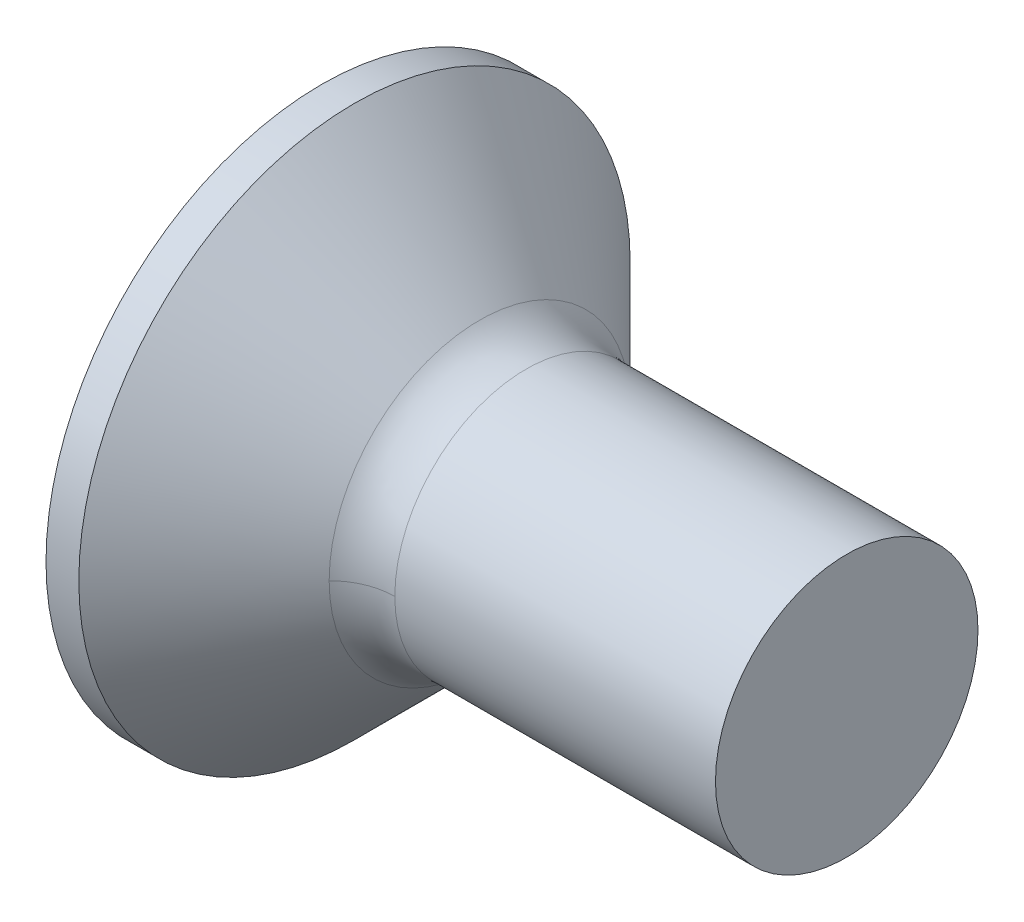
ISO-10303-21;
HEADER;
FILE_DESCRIPTION(('STEP AP214'),'2;1');
FILE_NAME('part.step','',(''),(''),'','','');
FILE_SCHEMA(('AUTOMOTIVE_DESIGN { 1 0 10303 214 1 1 1 1 }'));
ENDSEC;
DATA;
#1=APPLICATION_CONTEXT('core data for automotive mechanical design processes');
#2=APPLICATION_PROTOCOL_DEFINITION('international standard','automotive_design',2000,#1);
#3=PRODUCT_CONTEXT('',#1,'mechanical');
#4=PRODUCT('Part','Part','',(#3));
#5=PRODUCT_RELATED_PRODUCT_CATEGORY('part','',(#4));
#6=PRODUCT_DEFINITION_FORMATION('','',#4);
#7=PRODUCT_DEFINITION_CONTEXT('part definition',#1,'design');
#8=PRODUCT_DEFINITION('design','',#6,#7);
#9=PRODUCT_DEFINITION_SHAPE('','',#8);
#10=(LENGTH_UNIT() NAMED_UNIT(*) SI_UNIT(.MILLI.,.METRE.));
#11=(NAMED_UNIT(*) PLANE_ANGLE_UNIT() SI_UNIT($,.RADIAN.));
#12=(NAMED_UNIT(*) SI_UNIT($,.STERADIAN.) SOLID_ANGLE_UNIT());
#13=UNCERTAINTY_MEASURE_WITH_UNIT(LENGTH_MEASURE(1.E-05),#10,'distance_accuracy_value','');
#14=(GEOMETRIC_REPRESENTATION_CONTEXT(3) GLOBAL_UNCERTAINTY_ASSIGNED_CONTEXT((#13)) GLOBAL_UNIT_ASSIGNED_CONTEXT((#10,
#11,#12)) REPRESENTATION_CONTEXT('',''));
#15=CARTESIAN_POINT('',(0.,0.,0.));
#16=DIRECTION('',(0.,0.,1.));
#17=DIRECTION('',(1.,0.,0.));
#18=AXIS2_PLACEMENT_3D('',#15,#16,#17);
#19=CARTESIAN_POINT('',(2.51,0.,0.));
#20=DIRECTION('',(-1.,0.,0.));
#21=DIRECTION('',(0.,0.,1.));
#22=AXIS2_PLACEMENT_3D('',#19,#20,#21);
#23=CONICAL_SURFACE('',#22,0.851,0.0698131700884116);
#24=CARTESIAN_POINT('',(2.51000000000001,0.,0.));
#25=DIRECTION('',(-1.,0.,0.));
#26=DIRECTION('',(0.,0.,1.));
#27=AXIS2_PLACEMENT_3D('',#24,#25,#26);
#28=CIRCLE('',#27,0.851);
#29=CARTESIAN_POINT('',(2.51000000000001,0.515000000128447,-0.677477674811281));
#30=VERTEX_POINT('',#29);
#31=CARTESIAN_POINT('',(2.50999999998821,0.677477674911375,-0.514999999998138));
#32=VERTEX_POINT('',#31);
#33=EDGE_CURVE('E125',#30,#32,#28,.F.);
#34=ORIENTED_EDGE('',*,*,#33,.T.);
#35=CARTESIAN_POINT('',(-7.25470712172385E-11,0.887981255320598,-0.514999999738052));
#36=CARTESIAN_POINT('',(0.318819879636719,0.862192153268574,-0.51499999990922));
#37=CARTESIAN_POINT('',(0.637620357667007,0.836153848252877,-0.514999999976439));
#38=CARTESIAN_POINT('',(1.27515765628023,0.783330183982056,-0.515000000023561));
#39=CARTESIAN_POINT('',(1.59389447718419,0.756544828595421,-0.515000000003464));
#40=CARTESIAN_POINT('',(2.01216629989946,0.720736675273492,-0.514999999998918));
#41=CARTESIAN_POINT('',(2.11173974714975,0.712163242481372,-0.514999999999459));
#42=CARTESIAN_POINT('',(2.31087725771429,0.694906260205415,-0.515000000000541));
#43=CARTESIAN_POINT('',(2.41044132101322,0.686222710544853,-0.515000000001082));
#44=CARTESIAN_POINT('',(2.50999999997648,0.677477674910992,-0.515));
#45=B_SPLINE_CURVE_WITH_KNOTS('',3,(#35,#36,#37,#38,#39,#40,#41,#42,#43,#44),.UNSPECIFIED.,.F.,
.F.,(4,2,2,2,4),(0.,0.959584754186786,1.91916454022962,2.21899005858181,2.51881605817835),.UNSPECIFIED.);
#46=CARTESIAN_POINT('',(0.,0.887981255466366,-0.515));
#47=VERTEX_POINT('',#46);
#48=EDGE_CURVE('E118',#47,#32,#45,.T.);
#49=ORIENTED_EDGE('',*,*,#48,.F.);
#50=CARTESIAN_POINT('',(0.,0.,0.));
#51=DIRECTION('',(-1.,0.,0.));
#52=DIRECTION('',(0.,0.,1.));
#53=AXIS2_PLACEMENT_3D('',#50,#51,#52);
#54=CIRCLE('',#53,1.026516298);
#55=CARTESIAN_POINT('',(-2.85935113966268E-11,0.515,-0.887981255468678));
#56=VERTEX_POINT('',#55);
#57=EDGE_CURVE('E19',#47,#56,#54,.T.);
#58=ORIENTED_EDGE('',*,*,#57,.T.);
#59=CARTESIAN_POINT('',(2.50999999998217,0.515,-0.677477674910489));
#60=CARTESIAN_POINT('',(2.24584461878122,0.515,-0.700667679814435));
#61=CARTESIAN_POINT('',(1.98165392257068,0.515,-0.723450461944113));
#62=CARTESIAN_POINT('',(1.45321766745748,0.515,-0.768360402906354));
#63=CARTESIAN_POINT('',(1.18897210874822,0.515,-0.79048756401168));
#64=CARTESIAN_POINT('',(0.770601353287124,0.515,-0.825124883970429));
#65=CARTESIAN_POINT('',(0.616489661388993,0.515,-0.837798921148617));
#66=CARTESIAN_POINT('',(0.308253737302725,0.515,-0.862997437699919));
#67=CARTESIAN_POINT('',(0.154129505090094,0.515,-0.875521916773493));
#68=CARTESIAN_POINT('',(-5.6932000135886E-11,0.515,-0.887981255470971));
#69=B_SPLINE_CURVE_WITH_KNOTS('',3,(#59,#60,#61,#62,#63,#64,#65,#66,#67,#68),.UNSPECIFIED.,.F.,
.F.,(4,2,2,2,4),(0.,0.795513110102209,1.59102346217274,2.05491931016661,2.51881608711106),.UNSPECIFIED.);
#70=EDGE_CURVE('E148',#30,#56,#69,.T.);
#71=ORIENTED_EDGE('',*,*,#70,.F.);
#72=EDGE_LOOP('',(#34,#49,#58,#71));
#73=FACE_BOUND('',#72,.T.);
#74=ADVANCED_FACE('F15',(#73),#23,.F.);
#75=CARTESIAN_POINT('',(0.,0.668342541,-0.515));
#76=DIRECTION('',(0.,0.,1.));
#77=DIRECTION('',(1.,0.,0.));
#78=AXIS2_PLACEMENT_3D('',#75,#76,#77);
#79=PLANE('',#78);
#80=DIRECTION('',(0.,1.,0.));
#81=VECTOR('',#80,1.);
#82=CARTESIAN_POINT('',(2.51,1.4387388375,-0.515));
#83=LINE('',#82,#81);
#84=CARTESIAN_POINT('',(2.51,0.948560206845572,-0.515));
#85=VERTEX_POINT('',#84);
#86=EDGE_CURVE('E139',#32,#85,#83,.T.);
#87=ORIENTED_EDGE('',*,*,#86,.T.);
#88=DIRECTION('',(0.894934367754668,-0.446197800769517,0.));
#89=VECTOR('',#88,1.);
#90=CARTESIAN_POINT('',(1.255,1.5742801035,-0.515));
#91=LINE('',#90,#89);
#92=CARTESIAN_POINT('',(0.,2.19999999989061,-0.515));
#93=VERTEX_POINT('',#92);
#94=EDGE_CURVE('E122',#93,#85,#91,.T.);
#95=ORIENTED_EDGE('',*,*,#94,.F.);
#96=DIRECTION('',(0.,-1.,0.));
#97=VECTOR('',#96,1.);
#98=CARTESIAN_POINT('',(0.,1.4387388375,-0.515));
#99=LINE('',#98,#97);
#100=EDGE_CURVE('E113',#93,#47,#99,.T.);
#101=ORIENTED_EDGE('',*,*,#100,.T.);
#102=ORIENTED_EDGE('',*,*,#48,.T.);
#103=EDGE_LOOP('',(#87,#95,#101,#102));
#104=FACE_BOUND('',#103,.T.);
#105=ADVANCED_FACE('F116',(#104),#79,.T.);
#106=CARTESIAN_POINT('',(8.,-2.024,2.024));
#107=DIRECTION('',(1.,0.,0.));
#108=DIRECTION('',(0.,0.,-1.));
#109=AXIS2_PLACEMENT_3D('',#106,#107,#108);
#110=PLANE('',#109);
#111=CARTESIAN_POINT('',(8.,0.,0.));
#112=DIRECTION('',(-1.,0.,0.));
#113=DIRECTION('',(0.,0.,1.));
#114=AXIS2_PLACEMENT_3D('',#111,#112,#113);
#115=CIRCLE('',#114,2.);
#116=CARTESIAN_POINT('',(8.,0.,2.));
#117=VERTEX_POINT('',#116);
#118=EDGE_CURVE('E380',#117,#117,#115,.F.);
#119=ORIENTED_EDGE('',*,*,#118,.T.);
#120=EDGE_LOOP('',(#119));
#121=FACE_BOUND('',#120,.T.);
#122=ADVANCED_FACE('F519',(#121),#110,.T.);
#123=CARTESIAN_POINT('',(0.,0.515,-2.209135134));
#124=DIRECTION('',(0.,-1.,0.));
#125=DIRECTION('',(1.,0.,0.));
#126=AXIS2_PLACEMENT_3D('',#123,#124,#125);
#127=PLANE('',#126);
#128=DIRECTION('',(0.,0.,-1.));
#129=VECTOR('',#128,1.);
#130=CARTESIAN_POINT('',(0.,0.515,-1.4387388375));
#131=LINE('',#130,#129);
#132=CARTESIAN_POINT('',(0.,0.515,-2.19999999989061));
#133=VERTEX_POINT('',#132);
#134=EDGE_CURVE('E134',#56,#133,#131,.T.);
#135=ORIENTED_EDGE('',*,*,#134,.T.);
#136=DIRECTION('',(-0.894934367754668,0.,-0.446197800769517));
#137=VECTOR('',#136,1.);
#138=CARTESIAN_POINT('',(1.255,0.515,-1.5742801035));
#139=LINE('',#138,#137);
#140=CARTESIAN_POINT('',(2.51,0.515,-0.948560206845572));
#141=VERTEX_POINT('',#140);
#142=EDGE_CURVE('E362',#141,#133,#139,.T.);
#143=ORIENTED_EDGE('',*,*,#142,.F.);
#144=DIRECTION('',(0.,0.,1.));
#145=VECTOR('',#144,1.);
#146=CARTESIAN_POINT('',(2.51,0.515,-1.4387388375));
#147=LINE('',#146,#145);
#148=EDGE_CURVE('E140',#141,#30,#147,.T.);
#149=ORIENTED_EDGE('',*,*,#148,.T.);
#150=ORIENTED_EDGE('',*,*,#70,.T.);
#151=EDGE_LOOP('',(#135,#143,#149,#150));
#152=FACE_BOUND('',#151,.T.);
#153=ADVANCED_FACE('F550',(#152),#127,.T.);
#154=CARTESIAN_POINT('',(0.,2.2,-0.515));
#155=DIRECTION('',(-0.446197800769517,-0.894934367754668,0.));
#156=DIRECTION('',(0.894934367754668,-0.446197800769517,0.));
#157=AXIS2_PLACEMENT_3D('',#154,#155,#156);
#158=PLANE('',#157);
#159=ORIENTED_EDGE('',*,*,#94,.T.);
#160=DIRECTION('',(0.,0.,1.));
#161=VECTOR('',#160,1.);
#162=CARTESIAN_POINT('',(2.51,0.948560207,0.));
#163=LINE('',#162,#161);
#164=CARTESIAN_POINT('',(2.51,0.948560206768358,0.515));
#165=VERTEX_POINT('',#164);
#166=EDGE_CURVE('E378',#85,#165,#163,.T.);
#167=ORIENTED_EDGE('',*,*,#166,.T.);
#168=DIRECTION('',(0.894934367735432,-0.446197800808098,0.));
#169=VECTOR('',#168,1.);
#170=CARTESIAN_POINT('',(0.,2.19999999967182,0.515));
#171=LINE('',#170,#169);
#172=CARTESIAN_POINT('',(0.,2.19999999983591,0.515));
#173=VERTEX_POINT('',#172);
#174=EDGE_CURVE('E352',#173,#165,#171,.T.);
#175=ORIENTED_EDGE('',*,*,#174,.F.);
#176=DIRECTION('',(0.,0.,-1.));
#177=VECTOR('',#176,1.);
#178=CARTESIAN_POINT('',(0.,2.2,0.));
#179=LINE('',#178,#177);
#180=EDGE_CURVE('E373',#173,#93,#179,.T.);
#181=ORIENTED_EDGE('',*,*,#180,.T.);
#182=EDGE_LOOP('',(#159,#167,#175,#181));
#183=FACE_BOUND('',#182,.T.);
#184=ADVANCED_FACE('F164',(#183),#158,.T.);
#185=CARTESIAN_POINT('',(8.,0.,0.));
#186=DIRECTION('',(-1.,0.,0.));
#187=DIRECTION('',(0.,0.,1.));
#188=AXIS2_PLACEMENT_3D('',#185,#186,#187);
#189=CYLINDRICAL_SURFACE('',#188,2.);
#190=ORIENTED_EDGE('',*,*,#118,.F.);
#191=EDGE_LOOP('',(#190));
#192=FACE_BOUND('',#191,.T.);
#193=CARTESIAN_POINT('',(3.11421356207373,0.,0.));
#194=DIRECTION('',(1.,0.,0.));
#195=DIRECTION('',(0.,1.,0.));
#196=AXIS2_PLACEMENT_3D('',#193,#194,#195);
#197=CIRCLE('',#196,2.00000000028272);
#198=CARTESIAN_POINT('',(3.11421356205332,-2.05103428515331E-10,-2.00000000021204));
#199=VERTEX_POINT('',#198);
#200=CARTESIAN_POINT('',(3.11421356207076,-8.9793628428733E-11,2.00000000021204));
#201=VERTEX_POINT('',#200);
#202=EDGE_CURVE('E342',#199,#201,#197,.T.);
#203=ORIENTED_EDGE('',*,*,#202,.T.);
#204=CARTESIAN_POINT('',(3.11421356207373,0.,0.));
#205=DIRECTION('',(1.,0.,0.));
#206=DIRECTION('',(0.,1.,0.));
#207=AXIS2_PLACEMENT_3D('',#204,#205,#206);
#208=CIRCLE('',#207,2.00000000028272);
#209=EDGE_CURVE('E331',#201,#199,#208,.T.);
#210=ORIENTED_EDGE('',*,*,#209,.T.);
#211=EDGE_LOOP('',(#203,#210));
#212=FACE_BOUND('',#211,.T.);
#213=ADVANCED_FACE('F159',(#192,#212),#189,.T.);
#214=CARTESIAN_POINT('',(2.51,0.515,-0.948560207));
#215=DIRECTION('',(-0.446197800769517,0.,0.894934367754668));
#216=DIRECTION('',(-0.894934367754668,0.,-0.446197800769517));
#217=AXIS2_PLACEMENT_3D('',#214,#215,#216);
#218=PLANE('',#217);
#219=DIRECTION('',(-0.894934367735432,0.,-0.446197800808098));
#220=VECTOR('',#219,1.);
#221=CARTESIAN_POINT('',(2.51,-0.515,-0.948560206536716));
#222=LINE('',#221,#220);
#223=CARTESIAN_POINT('',(2.51,-0.515,-0.948560206768358));
#224=VERTEX_POINT('',#223);
#225=CARTESIAN_POINT('',(0.,-0.515,-2.19999999983591));
#226=VERTEX_POINT('',#225);
#227=EDGE_CURVE('E317',#224,#226,#222,.T.);
#228=ORIENTED_EDGE('',*,*,#227,.F.);
#229=DIRECTION('',(0.,1.,0.));
#230=VECTOR('',#229,1.);
#231=CARTESIAN_POINT('',(2.51,0.,-0.948560207));
#232=LINE('',#231,#230);
#233=EDGE_CURVE('E355',#224,#141,#232,.T.);
#234=ORIENTED_EDGE('',*,*,#233,.T.);
#235=ORIENTED_EDGE('',*,*,#142,.T.);
#236=DIRECTION('',(0.,-1.,0.));
#237=VECTOR('',#236,1.);
#238=CARTESIAN_POINT('',(0.,0.,-2.2));
#239=LINE('',#238,#237);
#240=EDGE_CURVE('E358',#133,#226,#239,.T.);
#241=ORIENTED_EDGE('',*,*,#240,.T.);
#242=EDGE_LOOP('',(#228,#234,#235,#241));
#243=FACE_BOUND('',#242,.T.);
#244=ADVANCED_FACE('F163',(#243),#218,.T.);
#245=CARTESIAN_POINT('',(0.,0.668342541,0.515));
#246=DIRECTION('',(0.,0.,-1.));
#247=DIRECTION('',(0.,1.,0.));
#248=AXIS2_PLACEMENT_3D('',#245,#246,#247);
#249=PLANE('',#248);
#250=DIRECTION('',(0.,1.,0.));
#251=VECTOR('',#250,1.);
#252=CARTESIAN_POINT('',(0.,1.4387388375,0.515));
#253=LINE('',#252,#251);
#254=CARTESIAN_POINT('',(0.,0.887981255466366,0.515));
#255=VERTEX_POINT('',#254);
#256=EDGE_CURVE('E347',#255,#173,#253,.T.);
#257=ORIENTED_EDGE('',*,*,#256,.T.);
#258=ORIENTED_EDGE('',*,*,#174,.T.);
#259=DIRECTION('',(0.,-1.,0.));
#260=VECTOR('',#259,1.);
#261=CARTESIAN_POINT('',(2.51,1.4387388375,0.515));
#262=LINE('',#261,#260);
#263=CARTESIAN_POINT('',(2.51000000000001,0.677477675015967,0.514999999859184));
#264=VERTEX_POINT('',#263);
#265=EDGE_CURVE('E353',#165,#264,#262,.T.);
#266=ORIENTED_EDGE('',*,*,#265,.T.);
#267=CARTESIAN_POINT('',(-6.23890795979364E-11,0.887981255359255,0.514999999806251));
#268=CARTESIAN_POINT('',(0.318819879644557,0.862192153281618,0.514999999932855));
#269=CARTESIAN_POINT('',(0.637620357673799,0.83615384825587,0.514999999982573));
#270=CARTESIAN_POINT('',(1.27515765628601,0.78333018397802,0.515000000017427));
#271=CARTESIAN_POINT('',(1.59389447719001,0.756544828594407,0.515000000002563));
#272=CARTESIAN_POINT('',(2.01216629990365,0.720736675273295,0.514999999999199));
#273=CARTESIAN_POINT('',(2.11173974715245,0.71216324248122,0.5149999999996));
#274=CARTESIAN_POINT('',(2.31087725771403,0.694906260205355,0.5150000000004));
#275=CARTESIAN_POINT('',(2.41044132101147,0.686222710544842,0.515000000000801));
#276=CARTESIAN_POINT('',(2.50999999997326,0.677477674911275,0.515));
#277=B_SPLINE_CURVE_WITH_KNOTS('',3,(#267,#268,#269,#270,#271,#272,#273,#274,#275,#276),
.UNSPECIFIED.,.F.,.F.,(4,2,2,2,4),(0.,0.959584754186115,1.91916454022833,2.21899005857607,
2.51881605816815),.UNSPECIFIED.);
#278=EDGE_CURVE('E199',#255,#264,#277,.T.);
#279=ORIENTED_EDGE('',*,*,#278,.F.);
#280=EDGE_LOOP('',(#257,#258,#266,#279));
#281=FACE_BOUND('',#280,.T.);
#282=ADVANCED_FACE('F172',(#281),#249,.T.);
#283=CARTESIAN_POINT('',(3.214046979,0.,2.004995835));
#284=CARTESIAN_POINT('',(3.214046979,4.009991669,2.004995835));
#285=CARTESIAN_POINT('',(3.214046979,4.009991669,-2.004995835));
#286=CARTESIAN_POINT('',(3.214046979,0.,-2.004995835));
#287=CARTESIAN_POINT('',(2.873263226,0.,1.970803409));
#288=CARTESIAN_POINT('',(2.873263226,3.941606817,1.970803409));
#289=CARTESIAN_POINT('',(2.873263226,3.941606817,-1.970803409));
#290=CARTESIAN_POINT('',(2.873263226,0.,-1.970803409));
#291=CARTESIAN_POINT('',(2.55683929,0.,2.101870494));
#292=CARTESIAN_POINT('',(2.55683929,4.203740989,2.101870494));
#293=CARTESIAN_POINT('',(2.55683929,4.203740989,-2.101870494));
#294=CARTESIAN_POINT('',(2.55683929,0.,-2.101870494));
#295=CARTESIAN_POINT('',(2.340046484,0.,2.367018693));
#296=CARTESIAN_POINT('',(2.340046484,4.734037387,2.367018693));
#297=CARTESIAN_POINT('',(2.340046484,4.734037387,-2.367018693));
#298=CARTESIAN_POINT('',(2.340046484,0.,-2.367018693));
#299=(BOUNDED_SURFACE() B_SPLINE_SURFACE(3,3,((#283,#284,#285,#286),(#287,#288,#289,#290),(#291,
#292,#293,#294),(#295,#296,#297,#298)),.UNSPECIFIED.,.F.,.F.,
.F.) B_SPLINE_SURFACE_WITH_KNOTS((4,4),(4,4),(0.,1.),(0.,1.),
.UNSPECIFIED.) GEOMETRIC_REPRESENTATION_ITEM() RATIONAL_B_SPLINE_SURFACE(((1.,0.333333333333333,
0.333333333333333,1.),(0.920706259011135,0.306902086337045,0.306902086337045,0.920706259011135),
(0.920706259011135,0.306902086337045,0.306902086337045,0.920706259011135),(1.,0.333333333333333,
0.333333333333333,1.))) REPRESENTATION_ITEM('') SURFACE());
#300=CARTESIAN_POINT('',(2.40710678099998,0.,0.));
#301=DIRECTION('',(-1.,0.,0.));
#302=DIRECTION('',(0.,0.,1.));
#303=AXIS2_PLACEMENT_3D('',#300,#301,#302);
#304=CIRCLE('',#303,2.292893219);
#305=CARTESIAN_POINT('',(2.40710678110323,-7.05420390654683E-10,-2.29289321882874));
#306=VERTEX_POINT('',#305);
#307=CARTESIAN_POINT('',(2.40710678096737,-2.05887201733649E-10,2.2928932189646));
#308=VERTEX_POINT('',#307);
#309=EDGE_CURVE('E303',#306,#308,#304,.F.);
#310=CARTESIAN_POINT('',(3.214046979,0.,2.004995835));
#311=CARTESIAN_POINT('',(2.873263226,0.,1.970803409));
#312=CARTESIAN_POINT('',(2.55683929,0.,2.101870494));
#313=CARTESIAN_POINT('',(2.340046484,0.,2.367018693));
#314=(BOUNDED_CURVE() B_SPLINE_CURVE(3,(#310,#311,#312,#313),.UNSPECIFIED.,.F.,
.F.) B_SPLINE_CURVE_WITH_KNOTS((4,4),(0.,1.),
.UNSPECIFIED.) CURVE() GEOMETRIC_REPRESENTATION_ITEM() RATIONAL_B_SPLINE_CURVE((1.,
0.920706259011135,0.920706259011135,1.)) REPRESENTATION_ITEM(''));
#315=EDGE_CURVE('E336',#308,#201,#314,.F.);
#316=CARTESIAN_POINT('',(3.214046979,0.,-2.004995835));
#317=CARTESIAN_POINT('',(2.873263226,0.,-1.970803409));
#318=CARTESIAN_POINT('',(2.55683929,0.,-2.101870494));
#319=CARTESIAN_POINT('',(2.340046484,0.,-2.367018693));
#320=(BOUNDED_CURVE() B_SPLINE_CURVE(3,(#316,#317,#318,#319),.UNSPECIFIED.,.F.,
.F.) B_SPLINE_CURVE_WITH_KNOTS((4,4),(0.,1.),
.UNSPECIFIED.) CURVE() GEOMETRIC_REPRESENTATION_ITEM() RATIONAL_B_SPLINE_CURVE((1.,
0.920706259011135,0.920706259011135,1.)) REPRESENTATION_ITEM(''));
#321=EDGE_CURVE('E322',#199,#306,#320,.T.);
#322=ORIENTED_EDGE('',*,*,#309,.T.);
#323=ORIENTED_EDGE('',*,*,#315,.T.);
#324=ORIENTED_EDGE('',*,*,#202,.F.);
#325=ORIENTED_EDGE('',*,*,#321,.T.);
#326=EDGE_LOOP('',(#322,#323,#324,#325));
#327=FACE_BOUND('',#326,.T.);
#328=ADVANCED_FACE('F166',(#327),#299,.F.);
#329=CARTESIAN_POINT('',(3.214046979,0.,-2.004995835));
#330=CARTESIAN_POINT('',(3.214046979,-4.009991669,-2.004995835));
#331=CARTESIAN_POINT('',(3.214046979,-4.009991669,2.004995835));
#332=CARTESIAN_POINT('',(3.214046979,0.,2.004995835));
#333=CARTESIAN_POINT('',(2.873263226,0.,-1.970803409));
#334=CARTESIAN_POINT('',(2.873263226,-3.941606817,-1.970803409));
#335=CARTESIAN_POINT('',(2.873263226,-3.941606817,1.970803409));
#336=CARTESIAN_POINT('',(2.873263226,0.,1.970803409));
#337=CARTESIAN_POINT('',(2.55683929,0.,-2.101870494));
#338=CARTESIAN_POINT('',(2.55683929,-4.203740989,-2.101870494));
#339=CARTESIAN_POINT('',(2.55683929,-4.203740989,2.101870494));
#340=CARTESIAN_POINT('',(2.55683929,0.,2.101870494));
#341=CARTESIAN_POINT('',(2.340046484,0.,-2.367018693));
#342=CARTESIAN_POINT('',(2.340046484,-4.734037387,-2.367018693));
#343=CARTESIAN_POINT('',(2.340046484,-4.734037387,2.367018693));
#344=CARTESIAN_POINT('',(2.340046484,0.,2.367018693));
#345=(BOUNDED_SURFACE() B_SPLINE_SURFACE(3,3,((#329,#330,#331,#332),(#333,#334,#335,#336),(#337,
#338,#339,#340),(#341,#342,#343,#344)),.UNSPECIFIED.,.F.,.F.,
.F.) B_SPLINE_SURFACE_WITH_KNOTS((4,4),(4,4),(0.,1.),(0.,1.),
.UNSPECIFIED.) GEOMETRIC_REPRESENTATION_ITEM() RATIONAL_B_SPLINE_SURFACE(((1.,0.333333333333333,
0.333333333333333,1.),(0.920706259011135,0.306902086337045,0.306902086337045,0.920706259011135),
(0.920706259011135,0.306902086337045,0.306902086337045,0.920706259011135),(1.,0.333333333333333,
0.333333333333333,1.))) REPRESENTATION_ITEM('') SURFACE());
#346=CARTESIAN_POINT('',(2.40710678099998,0.,0.));
#347=DIRECTION('',(-1.,0.,0.));
#348=DIRECTION('',(0.,0.,1.));
#349=AXIS2_PLACEMENT_3D('',#346,#347,#348);
#350=CIRCLE('',#349,2.292893219);
#351=EDGE_CURVE('E297',#308,#306,#350,.F.);
#352=ORIENTED_EDGE('',*,*,#321,.F.);
#353=ORIENTED_EDGE('',*,*,#209,.F.);
#354=ORIENTED_EDGE('',*,*,#315,.F.);
#355=ORIENTED_EDGE('',*,*,#351,.T.);
#356=EDGE_LOOP('',(#352,#353,#354,#355));
#357=FACE_BOUND('',#356,.T.);
#358=ADVANCED_FACE('F171',(#357),#345,.F.);
#359=CARTESIAN_POINT('',(0.,-0.515,-2.209135134));
#360=DIRECTION('',(0.,1.,0.));
#361=DIRECTION('',(0.,0.,1.));
#362=AXIS2_PLACEMENT_3D('',#359,#360,#361);
#363=PLANE('',#362);
#364=DIRECTION('',(0.,0.,-1.));
#365=VECTOR('',#364,1.);
#366=CARTESIAN_POINT('',(2.51,-0.515,-1.4387388375));
#367=LINE('',#366,#365);
#368=CARTESIAN_POINT('',(2.51000000000001,-0.515000000067614,-0.677477674857525));
#369=VERTEX_POINT('',#368);
#370=EDGE_CURVE('E318',#369,#224,#367,.T.);
#371=ORIENTED_EDGE('',*,*,#370,.T.);
#372=ORIENTED_EDGE('',*,*,#227,.T.);
#373=DIRECTION('',(0.,0.,1.));
#374=VECTOR('',#373,1.);
#375=CARTESIAN_POINT('',(0.,-0.515,-1.4387388375));
#376=LINE('',#375,#374);
#377=CARTESIAN_POINT('',(-2.98730558439721E-11,-0.515,-0.887981255468781));
#378=VERTEX_POINT('',#377);
#379=EDGE_CURVE('E320',#226,#378,#376,.T.);
#380=ORIENTED_EDGE('',*,*,#379,.T.);
#381=CARTESIAN_POINT('',(2.50999999998707,-0.515,-0.677477674910059));
#382=CARTESIAN_POINT('',(2.24584461878623,-0.515,-0.700667679814001));
#383=CARTESIAN_POINT('',(1.98165392257579,-0.515,-0.723450461943674));
#384=CARTESIAN_POINT('',(1.45321766746281,-0.515,-0.768360402905906));
#385=CARTESIAN_POINT('',(1.18897210875365,-0.515,-0.790487564011227));
#386=CARTESIAN_POINT('',(0.77060135329132,-0.515,-0.825124883970084));
#387=CARTESIAN_POINT('',(0.616489661391847,-0.515,-0.837798921148383));
#388=CARTESIAN_POINT('',(0.308253737302892,-0.515,-0.862997437699906));
#389=CARTESIAN_POINT('',(0.154129505088917,-0.515,-0.875521916773589));
#390=CARTESIAN_POINT('',(-5.94528920877672E-11,-0.515,-0.887981255471175));
#391=B_SPLINE_CURVE_WITH_KNOTS('',3,(#381,#382,#383,#384,#385,#386,#387,#388,#389,#390),
.UNSPECIFIED.,.F.,.F.,(4,2,2,2,4),(0.,0.795513110101889,1.5910234621721,2.05491931017002,
2.5188160871185),.UNSPECIFIED.);
#392=EDGE_CURVE('E289',#369,#378,#391,.T.);
#393=ORIENTED_EDGE('',*,*,#392,.F.);
#394=EDGE_LOOP('',(#371,#372,#380,#393));
#395=FACE_BOUND('',#394,.T.);
#396=ADVANCED_FACE('F183',(#395),#363,.T.);
#397=CARTESIAN_POINT('',(2.51,0.,0.));
#398=DIRECTION('',(-1.,0.,0.));
#399=DIRECTION('',(0.,0.,1.));
#400=AXIS2_PLACEMENT_3D('',#397,#398,#399);
#401=CONICAL_SURFACE('',#400,0.851,0.0698131700884116);
#402=CARTESIAN_POINT('',(0.,0.,0.));
#403=DIRECTION('',(-1.,0.,0.));
#404=DIRECTION('',(0.,0.,1.));
#405=AXIS2_PLACEMENT_3D('',#402,#403,#404);
#406=CIRCLE('',#405,1.026516298);
#407=CARTESIAN_POINT('',(0.,0.515,0.887981255466366));
#408=VERTEX_POINT('',#407);
#409=EDGE_CURVE('E316',#408,#255,#406,.T.);
#410=ORIENTED_EDGE('',*,*,#409,.T.);
#411=ORIENTED_EDGE('',*,*,#278,.T.);
#412=CARTESIAN_POINT('',(2.51000000000001,0.,0.));
#413=DIRECTION('',(-1.,0.,0.));
#414=DIRECTION('',(0.,0.,1.));
#415=AXIS2_PLACEMENT_3D('',#412,#413,#414);
#416=CIRCLE('',#415,0.851);
#417=CARTESIAN_POINT('',(2.50999999998668,0.514999999928661,0.677477674964324));
#418=VERTEX_POINT('',#417);
#419=EDGE_CURVE('E313',#264,#418,#416,.F.);
#420=ORIENTED_EDGE('',*,*,#419,.T.);
#421=CARTESIAN_POINT('',(-6.26901258969882E-11,0.514999999808638,0.887981255360661));
#422=CARTESIAN_POINT('',(0.31881987964419,0.514999999933682,0.862192153282127));
#423=CARTESIAN_POINT('',(0.637620357673408,0.514999999982788,0.836153848256026));
#424=CARTESIAN_POINT('',(1.27515765628561,0.515000000017212,0.783330183977929));
#425=CARTESIAN_POINT('',(1.59389447718963,0.515000000002531,0.756544828594421));
#426=CARTESIAN_POINT('',(2.01216629990336,0.514999999999209,0.720736675273325));
#427=CARTESIAN_POINT('',(2.11173974715225,0.514999999999605,0.712163242481241));
#428=CARTESIAN_POINT('',(2.31087725771398,0.515000000000395,0.694906260205356));
#429=CARTESIAN_POINT('',(2.41044132101151,0.515000000000791,0.686222710544833));
#430=CARTESIAN_POINT('',(2.50999999997338,0.515,0.677477674911264));
#431=B_SPLINE_CURVE_WITH_KNOTS('',3,(#421,#422,#423,#424,#425,#426,#427,#428,#429,#430),
.UNSPECIFIED.,.F.,.F.,(4,2,2,2,4),(0.,0.959584754186134,1.91916454022837,2.21899005857636,
2.51881605816869),.UNSPECIFIED.);
#432=EDGE_CURVE('E207',#408,#418,#431,.T.);
#433=ORIENTED_EDGE('',*,*,#432,.F.);
#434=EDGE_LOOP('',(#410,#411,#420,#433));
#435=FACE_BOUND('',#434,.T.);
#436=ADVANCED_FACE('F185',(#435),#401,.F.);
#437=CARTESIAN_POINT('',(2.407106781,0.,0.));
#438=DIRECTION('',(-1.,0.,0.));
#439=DIRECTION('',(0.,0.,1.));
#440=AXIS2_PLACEMENT_3D('',#437,#438,#439);
#441=CONICAL_SURFACE('',#440,2.292893219,0.785398163397448);
#442=ORIENTED_EDGE('',*,*,#351,.F.);
#443=ORIENTED_EDGE('',*,*,#309,.F.);
#444=EDGE_LOOP('',(#442,#443));
#445=FACE_BOUND('',#444,.T.);
#446=CARTESIAN_POINT('',(0.5,0.,0.));
#447=DIRECTION('',(-1.,0.,0.));
#448=DIRECTION('',(0.,0.,1.));
#449=AXIS2_PLACEMENT_3D('',#446,#447,#448);
#450=CIRCLE('',#449,4.2);
#451=CARTESIAN_POINT('',(0.5,0.,4.2));
#452=VERTEX_POINT('',#451);
#453=EDGE_CURVE('E309',#452,#452,#450,.F.);
#454=ORIENTED_EDGE('',*,*,#453,.T.);
#455=EDGE_LOOP('',(#454));
#456=FACE_BOUND('',#455,.T.);
#457=ADVANCED_FACE('F194',(#445,#456),#441,.T.);
#458=CARTESIAN_POINT('',(2.51,0.,0.));
#459=DIRECTION('',(-1.,0.,0.));
#460=DIRECTION('',(0.,0.,1.));
#461=AXIS2_PLACEMENT_3D('',#458,#459,#460);
#462=CONICAL_SURFACE('',#461,0.851,0.0698131700884116);
#463=CARTESIAN_POINT('',(0.,0.,0.));
#464=DIRECTION('',(-1.,0.,0.));
#465=DIRECTION('',(0.,0.,1.));
#466=AXIS2_PLACEMENT_3D('',#463,#464,#465);
#467=CIRCLE('',#466,1.026516298);
#468=CARTESIAN_POINT('',(0.,-0.887981256473654,-0.514999998263199));
#469=VERTEX_POINT('',#468);
#470=EDGE_CURVE('E223',#378,#469,#467,.T.);
#471=ORIENTED_EDGE('',*,*,#470,.T.);
#472=CARTESIAN_POINT('',(2.5099999999791,-0.677477674910759,-0.515));
#473=CARTESIAN_POINT('',(2.24584461877809,-0.700667679814707,-0.515));
#474=CARTESIAN_POINT('',(1.98165392256748,-0.723450461944388,-0.515));
#475=CARTESIAN_POINT('',(1.45321766745415,-0.768360402906635,-0.515));
#476=CARTESIAN_POINT('',(1.18897210874481,-0.790487564011964,-0.515));
#477=CARTESIAN_POINT('',(0.770601353275102,-0.825124883971423,-0.515));
#478=CARTESIAN_POINT('',(0.616489661368421,-0.837798921150308,-0.515));
#479=CARTESIAN_POINT('',(0.308253737265049,-0.862997437702989,-0.515));
#480=CARTESIAN_POINT('',(0.154129505043866,-0.875521916777246,-0.515));
#481=CARTESIAN_POINT('',(-1.11713501698456E-10,-0.887981255475399,-0.515));
#482=B_SPLINE_CURVE_WITH_KNOTS('',3,(#472,#473,#474,#475,#476,#477,#478,#479,#480,#481),
.UNSPECIFIED.,.F.,.F.,(4,2,2,2,4),(0.,0.79551311010241,1.59102346217314,2.05491931019275,
2.51881608716294),.UNSPECIFIED.);
#483=CARTESIAN_POINT('',(2.51000000000001,-0.677477674864095,-0.51500000005897));
#484=VERTEX_POINT('',#483);
#485=EDGE_CURVE('E217',#484,#469,#482,.T.);
#486=ORIENTED_EDGE('',*,*,#485,.F.);
#487=CARTESIAN_POINT('',(2.51000000000001,0.,0.));
#488=DIRECTION('',(-1.,0.,0.));
#489=DIRECTION('',(0.,0.,1.));
#490=AXIS2_PLACEMENT_3D('',#487,#488,#489);
#491=CIRCLE('',#490,0.851);
#492=EDGE_CURVE('E294',#484,#369,#491,.F.);
#493=ORIENTED_EDGE('',*,*,#492,.T.);
#494=ORIENTED_EDGE('',*,*,#392,.T.);
#495=EDGE_LOOP('',(#471,#486,#493,#494));
#496=FACE_BOUND('',#495,.T.);
#497=ADVANCED_FACE('F229',(#496),#462,.F.);
#498=CARTESIAN_POINT('',(0.,0.515,0.668342541));
#499=DIRECTION('',(0.,-1.,0.));
#500=DIRECTION('',(1.,0.,0.));
#501=AXIS2_PLACEMENT_3D('',#498,#499,#500);
#502=PLANE('',#501);
#503=DIRECTION('',(0.,0.,1.));
#504=VECTOR('',#503,1.);
#505=CARTESIAN_POINT('',(2.51,0.515,1.4387388375));
#506=LINE('',#505,#504);
#507=CARTESIAN_POINT('',(2.51,0.515,0.948560206845572));
#508=VERTEX_POINT('',#507);
#509=EDGE_CURVE('E215',#418,#508,#506,.T.);
#510=ORIENTED_EDGE('',*,*,#509,.T.);
#511=DIRECTION('',(0.894934367754668,0.,-0.446197800769517));
#512=VECTOR('',#511,1.);
#513=CARTESIAN_POINT('',(1.255,0.515,1.5742801035));
#514=LINE('',#513,#512);
#515=CARTESIAN_POINT('',(-1.78042765715721E-10,0.514999998842133,2.20000000042524));
#516=VERTEX_POINT('',#515);
#517=EDGE_CURVE('E454',#516,#508,#514,.T.);
#518=ORIENTED_EDGE('',*,*,#517,.F.);
#519=DIRECTION('',(0.,0.,-1.));
#520=VECTOR('',#519,1.);
#521=CARTESIAN_POINT('',(0.,0.515,1.4387388375));
#522=LINE('',#521,#520);
#523=EDGE_CURVE('E216',#516,#408,#522,.T.);
#524=ORIENTED_EDGE('',*,*,#523,.T.);
#525=ORIENTED_EDGE('',*,*,#432,.T.);
#526=EDGE_LOOP('',(#510,#518,#524,#525));
#527=FACE_BOUND('',#526,.T.);
#528=ADVANCED_FACE('F224',(#527),#502,.T.);
#529=CARTESIAN_POINT('',(0.5,0.,0.));
#530=DIRECTION('',(-1.,0.,0.));
#531=DIRECTION('',(0.,0.,1.));
#532=AXIS2_PLACEMENT_3D('',#529,#530,#531);
#533=CYLINDRICAL_SURFACE('',#532,4.2);
#534=ORIENTED_EDGE('',*,*,#453,.F.);
#535=EDGE_LOOP('',(#534));
#536=FACE_BOUND('',#535,.T.);
#537=CARTESIAN_POINT('',(0.,0.,0.));
#538=DIRECTION('',(-1.,0.,0.));
#539=DIRECTION('',(0.,0.,1.));
#540=AXIS2_PLACEMENT_3D('',#537,#538,#539);
#541=CIRCLE('',#540,4.2);
#542=CARTESIAN_POINT('',(0.,0.,4.2));
#543=VERTEX_POINT('',#542);
#544=EDGE_CURVE('E453',#543,#543,#541,.T.);
#545=ORIENTED_EDGE('',*,*,#544,.F.);
#546=EDGE_LOOP('',(#545));
#547=FACE_BOUND('',#546,.T.);
#548=ADVANCED_FACE('F228',(#536,#547),#533,.T.);
#549=CARTESIAN_POINT('',(0.,-2.209135134,-0.515));
#550=DIRECTION('',(0.,0.,1.));
#551=DIRECTION('',(1.,0.,0.));
#552=AXIS2_PLACEMENT_3D('',#549,#550,#551);
#553=PLANE('',#552);
#554=DIRECTION('',(0.,1.,0.));
#555=VECTOR('',#554,1.);
#556=CARTESIAN_POINT('',(0.,0.,-0.514999996526399));
#557=LINE('',#556,#555);
#558=CARTESIAN_POINT('',(0.,-2.20000000044587,-0.514999998842133));
#559=VERTEX_POINT('',#558);
#560=EDGE_CURVE('E442',#559,#469,#557,.T.);
#561=ORIENTED_EDGE('',*,*,#560,.F.);
#562=DIRECTION('',(-0.894934367754668,-0.446197800769517,0.));
#563=VECTOR('',#562,1.);
#564=CARTESIAN_POINT('',(1.255,-1.5742801035,-0.515));
#565=LINE('',#564,#563);
#566=CARTESIAN_POINT('',(2.51,-0.948560206845572,-0.515));
#567=VERTEX_POINT('',#566);
#568=EDGE_CURVE('E439',#567,#559,#565,.T.);
#569=ORIENTED_EDGE('',*,*,#568,.F.);
#570=DIRECTION('',(0.,1.,0.));
#571=VECTOR('',#570,1.);
#572=CARTESIAN_POINT('',(2.51,-1.4387388375,-0.515));
#573=LINE('',#572,#571);
#574=EDGE_CURVE('E312',#567,#484,#573,.T.);
#575=ORIENTED_EDGE('',*,*,#574,.T.);
#576=ORIENTED_EDGE('',*,*,#485,.T.);
#577=EDGE_LOOP('',(#561,#569,#575,#576));
#578=FACE_BOUND('',#577,.T.);
#579=ADVANCED_FACE('F232',(#578),#553,.T.);
#580=CARTESIAN_POINT('',(0.,0.515,2.2));
#581=DIRECTION('',(-0.446197800769517,0.,-0.894934367754668));
#582=DIRECTION('',(0.894934367754668,0.,-0.446197800769517));
#583=AXIS2_PLACEMENT_3D('',#580,#581,#582);
#584=PLANE('',#583);
#585=ORIENTED_EDGE('',*,*,#517,.T.);
#586=DIRECTION('',(0.,-1.,0.));
#587=VECTOR('',#586,1.);
#588=CARTESIAN_POINT('',(2.51,0.,0.948560207));
#589=LINE('',#588,#587);
#590=CARTESIAN_POINT('',(2.51,-0.515,0.948560206768358));
#591=VERTEX_POINT('',#590);
#592=EDGE_CURVE('E451',#508,#591,#589,.T.);
#593=ORIENTED_EDGE('',*,*,#592,.T.);
#594=DIRECTION('',(0.894934367735432,0.,-0.446197800808098));
#595=VECTOR('',#594,1.);
#596=CARTESIAN_POINT('',(0.,-0.515,2.19999999967182));
#597=LINE('',#596,#595);
#598=CARTESIAN_POINT('',(0.,-0.515,2.20000000050471));
#599=VERTEX_POINT('',#598);
#600=EDGE_CURVE('E422',#599,#591,#597,.T.);
#601=ORIENTED_EDGE('',*,*,#600,.F.);
#602=DIRECTION('',(0.,-1.,0.));
#603=VECTOR('',#602,1.);
#604=CARTESIAN_POINT('',(0.,0.,2.2000000013376));
#605=LINE('',#604,#603);
#606=EDGE_CURVE('E445',#516,#599,#605,.T.);
#607=ORIENTED_EDGE('',*,*,#606,.F.);
#608=EDGE_LOOP('',(#585,#593,#601,#607));
#609=FACE_BOUND('',#608,.T.);
#610=ADVANCED_FACE('F236',(#609),#584,.T.);
#611=CARTESIAN_POINT('',(0.,-4.2504,-4.2504));
#612=DIRECTION('',(-1.,0.,0.));
#613=DIRECTION('',(0.,0.,1.));
#614=AXIS2_PLACEMENT_3D('',#611,#612,#613);
#615=PLANE('',#614);
#616=ORIENTED_EDGE('',*,*,#523,.F.);
#617=ORIENTED_EDGE('',*,*,#606,.T.);
#618=DIRECTION('',(0.,0.,1.));
#619=VECTOR('',#618,1.);
#620=CARTESIAN_POINT('',(0.,-0.515,1.4387388375));
#621=LINE('',#620,#619);
#622=CARTESIAN_POINT('',(0.,-0.515,0.887981255466366));
#623=VERTEX_POINT('',#622);
#624=EDGE_CURVE('E424',#623,#599,#621,.T.);
#625=ORIENTED_EDGE('',*,*,#624,.F.);
#626=CARTESIAN_POINT('',(0.,0.,0.));
#627=DIRECTION('',(-1.,0.,0.));
#628=DIRECTION('',(0.,0.,1.));
#629=AXIS2_PLACEMENT_3D('',#626,#627,#628);
#630=CIRCLE('',#629,1.026516298);
#631=CARTESIAN_POINT('',(0.,-0.887981255466366,0.515));
#632=VERTEX_POINT('',#631);
#633=EDGE_CURVE('E410',#623,#632,#630,.F.);
#634=ORIENTED_EDGE('',*,*,#633,.T.);
#635=DIRECTION('',(0.,1.,0.));
#636=VECTOR('',#635,1.);
#637=CARTESIAN_POINT('',(0.,-1.4387388375,0.515));
#638=LINE('',#637,#636);
#639=CARTESIAN_POINT('',(0.,-2.19999999983591,0.515));
#640=VERTEX_POINT('',#639);
#641=EDGE_CURVE('E418',#640,#632,#638,.T.);
#642=ORIENTED_EDGE('',*,*,#641,.F.);
#643=DIRECTION('',(0.,0.,1.));
#644=VECTOR('',#643,1.);
#645=CARTESIAN_POINT('',(0.,-2.2,0.));
#646=LINE('',#645,#644);
#647=EDGE_CURVE('E435',#559,#640,#646,.T.);
#648=ORIENTED_EDGE('',*,*,#647,.F.);
#649=ORIENTED_EDGE('',*,*,#560,.T.);
#650=ORIENTED_EDGE('',*,*,#470,.F.);
#651=ORIENTED_EDGE('',*,*,#379,.F.);
#652=ORIENTED_EDGE('',*,*,#240,.F.);
#653=ORIENTED_EDGE('',*,*,#134,.F.);
#654=ORIENTED_EDGE('',*,*,#57,.F.);
#655=ORIENTED_EDGE('',*,*,#100,.F.);
#656=ORIENTED_EDGE('',*,*,#180,.F.);
#657=ORIENTED_EDGE('',*,*,#256,.F.);
#658=ORIENTED_EDGE('',*,*,#409,.F.);
#659=EDGE_LOOP('',(#616,#617,#625,#634,#642,#648,#649,#650,#651,#652,#653,#654,#655,#656,#657,#658));
#660=FACE_BOUND('',#659,.T.);
#661=ORIENTED_EDGE('',*,*,#544,.T.);
#662=EDGE_LOOP('',(#661));
#663=FACE_BOUND('',#662,.T.);
#664=ADVANCED_FACE('F130',(#660,#663),#615,.T.);
#665=CARTESIAN_POINT('',(2.51,-0.948560207,-0.515));
#666=DIRECTION('',(-0.446197800769517,0.894934367754668,0.));
#667=DIRECTION('',(-0.894934367754668,-0.446197800769517,0.));
#668=AXIS2_PLACEMENT_3D('',#665,#666,#667);
#669=PLANE('',#668);
#670=DIRECTION('',(-0.894934367735432,-0.446197800808098,0.));
#671=VECTOR('',#670,1.);
#672=CARTESIAN_POINT('',(2.51,-0.948560206536716,0.515));
#673=LINE('',#672,#671);
#674=CARTESIAN_POINT('',(2.51,-0.948560206768358,0.515));
#675=VERTEX_POINT('',#674);
#676=EDGE_CURVE('E420',#675,#640,#673,.T.);
#677=ORIENTED_EDGE('',*,*,#676,.F.);
#678=DIRECTION('',(0.,0.,-1.));
#679=VECTOR('',#678,1.);
#680=CARTESIAN_POINT('',(2.51,-0.948560207,0.));
#681=LINE('',#680,#679);
#682=EDGE_CURVE('E432',#675,#567,#681,.T.);
#683=ORIENTED_EDGE('',*,*,#682,.T.);
#684=ORIENTED_EDGE('',*,*,#568,.T.);
#685=ORIENTED_EDGE('',*,*,#647,.T.);
#686=EDGE_LOOP('',(#677,#683,#684,#685));
#687=FACE_BOUND('',#686,.T.);
#688=ADVANCED_FACE('F243',(#687),#669,.T.);
#689=CARTESIAN_POINT('',(2.51,0.67585118,-0.515));
#690=DIRECTION('',(-1.,0.,0.));
#691=DIRECTION('',(0.,0.,1.));
#692=AXIS2_PLACEMENT_3D('',#689,#690,#691);
#693=PLANE('',#692);
#694=ORIENTED_EDGE('',*,*,#265,.F.);
#695=ORIENTED_EDGE('',*,*,#166,.F.);
#696=ORIENTED_EDGE('',*,*,#86,.F.);
#697=CARTESIAN_POINT('',(2.51,0.,0.));
#698=DIRECTION('',(-1.,0.,0.));
#699=DIRECTION('',(0.,0.,1.));
#700=AXIS2_PLACEMENT_3D('',#697,#698,#699);
#701=CIRCLE('',#700,0.851);
#702=EDGE_CURVE('E272',#264,#32,#701,.T.);
#703=ORIENTED_EDGE('',*,*,#702,.F.);
#704=EDGE_LOOP('',(#694,#695,#696,#703));
#705=FACE_BOUND('',#704,.T.);
#706=ADVANCED_FACE('F246',(#705),#693,.T.);
#707=CARTESIAN_POINT('',(0.,-0.515,0.668342541));
#708=DIRECTION('',(0.,1.,0.));
#709=DIRECTION('',(0.,0.,1.));
#710=AXIS2_PLACEMENT_3D('',#707,#708,#709);
#711=PLANE('',#710);
#712=ORIENTED_EDGE('',*,*,#624,.T.);
#713=ORIENTED_EDGE('',*,*,#600,.T.);
#714=DIRECTION('',(0.,0.,-1.));
#715=VECTOR('',#714,1.);
#716=CARTESIAN_POINT('',(2.51,-0.515,1.4387388375));
#717=LINE('',#716,#715);
#718=CARTESIAN_POINT('',(2.50999999999095,-0.514999999989494,0.677477674917705));
#719=VERTEX_POINT('',#718);
#720=EDGE_CURVE('E34',#591,#719,#717,.T.);
#721=ORIENTED_EDGE('',*,*,#720,.T.);
#722=CARTESIAN_POINT('',(-7.7649088548156E-11,-0.514999999696975,0.887981255297232));
#723=CARTESIAN_POINT('',(0.318819879632992,-0.514999999894984,0.862192153260636));
#724=CARTESIAN_POINT('',(0.637620357663888,-0.514999999972744,0.836153848250993));
#725=CARTESIAN_POINT('',(1.27515765627767,-0.515000000027256,0.783330183984409));
#726=CARTESIAN_POINT('',(1.59389447718159,-0.515000000004008,0.756544828595956));
#727=CARTESIAN_POINT('',(2.01216629989826,-0.514999999998748,0.720736675273497));
#728=CARTESIAN_POINT('',(2.11173974714989,-0.514999999999374,0.712163242481311));
#729=CARTESIAN_POINT('',(2.31087725771711,-0.515000000000626,0.694906260205219));
#730=CARTESIAN_POINT('',(2.41044132101739,-0.515000000001252,0.686222710544588));
#731=CARTESIAN_POINT('',(2.50999999998197,-0.515,0.67747767491051));
#732=B_SPLINE_CURVE_WITH_KNOTS('',3,(#722,#723,#724,#725,#726,#727,#728,#729,#730,#731),
.UNSPECIFIED.,.F.,.F.,(4,2,2,2,4),(0.,0.959584754187123,1.91916454023027,2.21899005858648,
2.51881605818705),.UNSPECIFIED.);
#733=EDGE_CURVE('E259',#623,#719,#732,.T.);
#734=ORIENTED_EDGE('',*,*,#733,.F.);
#735=EDGE_LOOP('',(#712,#713,#721,#734));
#736=FACE_BOUND('',#735,.T.);
#737=ADVANCED_FACE('F250',(#736),#711,.T.);
#738=CARTESIAN_POINT('',(0.,-2.209135134,0.515));
#739=DIRECTION('',(0.,0.,-1.));
#740=DIRECTION('',(0.,1.,0.));
#741=AXIS2_PLACEMENT_3D('',#738,#739,#740);
#742=PLANE('',#741);
#743=DIRECTION('',(0.,1.,0.));
#744=VECTOR('',#743,1.);
#745=CARTESIAN_POINT('',(2.51,-0.8122056935,0.515));
#746=LINE('',#745,#744);
#747=CARTESIAN_POINT('',(2.50999999999626,-0.677477674805039,0.51500000013709));
#748=VERTEX_POINT('',#747);
#749=EDGE_CURVE('E267',#675,#748,#746,.T.);
#750=ORIENTED_EDGE('',*,*,#749,.F.);
#751=ORIENTED_EDGE('',*,*,#676,.T.);
#752=ORIENTED_EDGE('',*,*,#641,.T.);
#753=CARTESIAN_POINT('',(2.50999999999252,-0.67747767490958,0.515));
#754=CARTESIAN_POINT('',(2.2458446187918,-0.700667679813517,0.515));
#755=CARTESIAN_POINT('',(1.98165392258148,-0.723450461943186,0.515));
#756=CARTESIAN_POINT('',(1.45321766746874,-0.768360402905407,0.515));
#757=CARTESIAN_POINT('',(1.1889721087597,-0.790487564010722,0.515));
#758=CARTESIAN_POINT('',(0.770601353297018,-0.825124883969614,0.515));
#759=CARTESIAN_POINT('',(0.616489661397075,-0.837798921147954,0.515));
#760=CARTESIAN_POINT('',(0.308253737307182,-0.862997437699557,0.515));
#761=CARTESIAN_POINT('',(0.154129505092738,-0.875521916773279,0.515));
#762=CARTESIAN_POINT('',(-5.61004891926854E-11,-0.887981255470903,0.515));
#763=B_SPLINE_CURVE_WITH_KNOTS('',3,(#753,#754,#755,#756,#757,#758,#759,#760,#761,#762),
.UNSPECIFIED.,.F.,.F.,(4,2,2,2,4),(0.,0.795513110101533,1.59102346217139,2.05491931017072,
2.51881608712061),.UNSPECIFIED.);
#764=EDGE_CURVE('E266',#748,#632,#763,.T.);
#765=ORIENTED_EDGE('',*,*,#764,.F.);
#766=EDGE_LOOP('',(#750,#751,#752,#765));
#767=FACE_BOUND('',#766,.T.);
#768=ADVANCED_FACE('F255',(#767),#742,.T.);
#769=CARTESIAN_POINT('',(2.51,-0.515,-0.948560207));
#770=DIRECTION('',(-1.,0.,0.));
#771=DIRECTION('',(0.,0.,1.));
#772=AXIS2_PLACEMENT_3D('',#769,#770,#771);
#773=PLANE('',#772);
#774=ORIENTED_EDGE('',*,*,#148,.F.);
#775=ORIENTED_EDGE('',*,*,#233,.F.);
#776=ORIENTED_EDGE('',*,*,#370,.F.);
#777=CARTESIAN_POINT('',(2.51000000000001,0.,0.));
#778=DIRECTION('',(-1.,0.,0.));
#779=DIRECTION('',(0.,0.,1.));
#780=AXIS2_PLACEMENT_3D('',#777,#778,#779);
#781=CIRCLE('',#780,0.850999999999961);
#782=EDGE_CURVE('E404',#30,#369,#781,.T.);
#783=ORIENTED_EDGE('',*,*,#782,.F.);
#784=EDGE_LOOP('',(#774,#775,#776,#783));
#785=FACE_BOUND('',#784,.T.);
#786=ADVANCED_FACE('F552',(#785),#773,.T.);
#787=CARTESIAN_POINT('',(2.51,-0.948560207,-0.515));
#788=DIRECTION('',(-1.,0.,0.));
#789=DIRECTION('',(0.,0.,1.));
#790=AXIS2_PLACEMENT_3D('',#787,#788,#789);
#791=PLANE('',#790);
#792=ORIENTED_EDGE('',*,*,#574,.F.);
#793=ORIENTED_EDGE('',*,*,#682,.F.);
#794=ORIENTED_EDGE('',*,*,#749,.T.);
#795=CARTESIAN_POINT('',(2.51,0.,0.));
#796=DIRECTION('',(-1.,0.,0.));
#797=DIRECTION('',(0.,0.,1.));
#798=AXIS2_PLACEMENT_3D('',#795,#796,#797);
#799=CIRCLE('',#798,0.851);
#800=EDGE_CURVE('E402',#484,#748,#799,.T.);
#801=ORIENTED_EDGE('',*,*,#800,.F.);
#802=EDGE_LOOP('',(#792,#793,#794,#801));
#803=FACE_BOUND('',#802,.T.);
#804=ADVANCED_FACE('F279',(#803),#791,.T.);
#805=CARTESIAN_POINT('',(2.51,0.,0.));
#806=DIRECTION('',(-1.,0.,0.));
#807=DIRECTION('',(0.,0.,1.));
#808=AXIS2_PLACEMENT_3D('',#805,#806,#807);
#809=CONICAL_SURFACE('',#808,0.851,0.0698131700884116);
#810=CARTESIAN_POINT('',(2.51000000000001,0.,0.));
#811=DIRECTION('',(-1.,0.,0.));
#812=DIRECTION('',(0.,0.,1.));
#813=AXIS2_PLACEMENT_3D('',#810,#811,#812);
#814=CIRCLE('',#813,0.851);
#815=EDGE_CURVE('E25',#748,#719,#814,.T.);
#816=ORIENTED_EDGE('',*,*,#815,.F.);
#817=ORIENTED_EDGE('',*,*,#764,.T.);
#818=ORIENTED_EDGE('',*,*,#633,.F.);
#819=ORIENTED_EDGE('',*,*,#733,.T.);
#820=EDGE_LOOP('',(#816,#817,#818,#819));
#821=FACE_BOUND('',#820,.T.);
#822=ADVANCED_FACE('F274',(#821),#809,.F.);
#823=CARTESIAN_POINT('',(2.51,-0.515,0.67585118));
#824=DIRECTION('',(-1.,0.,0.));
#825=DIRECTION('',(0.,0.,1.));
#826=AXIS2_PLACEMENT_3D('',#823,#824,#825);
#827=PLANE('',#826);
#828=ORIENTED_EDGE('',*,*,#720,.F.);
#829=ORIENTED_EDGE('',*,*,#592,.F.);
#830=ORIENTED_EDGE('',*,*,#509,.F.);
#831=CARTESIAN_POINT('',(2.51,0.,0.));
#832=DIRECTION('',(-1.,0.,0.));
#833=DIRECTION('',(0.,0.,1.));
#834=AXIS2_PLACEMENT_3D('',#831,#832,#833);
#835=CIRCLE('',#834,0.851);
#836=EDGE_CURVE('E9',#719,#418,#835,.T.);
#837=ORIENTED_EDGE('',*,*,#836,.F.);
#838=EDGE_LOOP('',(#828,#829,#830,#837));
#839=FACE_BOUND('',#838,.T.);
#840=ADVANCED_FACE('F17',(#839),#827,.T.);
#841=CARTESIAN_POINT('',(2.786506661,0.,0.));
#842=DIRECTION('',(-1.,0.,0.));
#843=DIRECTION('',(0.,0.,1.));
#844=AXIS2_PLACEMENT_3D('',#841,#842,#843);
#845=CONICAL_SURFACE('',#844,0.,1.25663706196119);
#846=CARTESIAN_POINT('',(2.786506661,0.,0.));
#847=VERTEX_POINT('',#846);
#848=VERTEX_LOOP('',#847);
#849=FACE_BOUND('',#848,.T.);
#850=ORIENTED_EDGE('',*,*,#815,.T.);
#851=ORIENTED_EDGE('',*,*,#836,.T.);
#852=ORIENTED_EDGE('',*,*,#419,.F.);
#853=ORIENTED_EDGE('',*,*,#702,.T.);
#854=ORIENTED_EDGE('',*,*,#33,.F.);
#855=ORIENTED_EDGE('',*,*,#782,.T.);
#856=ORIENTED_EDGE('',*,*,#492,.F.);
#857=ORIENTED_EDGE('',*,*,#800,.T.);
#858=EDGE_LOOP('',(#850,#851,#852,#853,#854,#855,#856,#857));
#859=FACE_BOUND('',#858,.T.);
#860=ADVANCED_FACE('F281',(#849,#859),#845,.F.);
#861=CLOSED_SHELL('',(#74,#105,#122,#153,#184,#213,#244,#282,#328,#358,#396,#436,#457,#497,#528,
#548,#579,#610,#664,#688,#706,#737,#768,#786,#804,#822,#840,#860));
#862=MANIFOLD_SOLID_BREP('B1',#861);
#863=ADVANCED_BREP_SHAPE_REPRESENTATION('',(#18,#862),#14);
#864=SHAPE_DEFINITION_REPRESENTATION(#9,#863);
ENDSEC;
END-ISO-10303-21;
